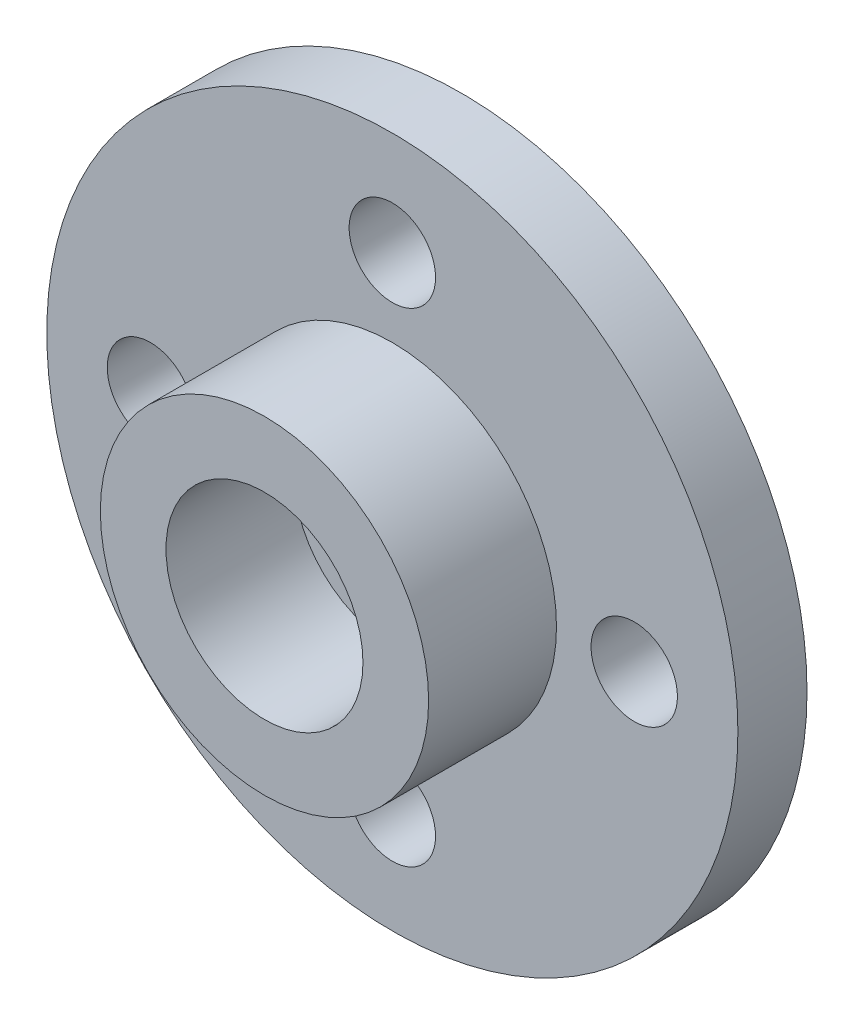
ISO-10303-21;
HEADER;
FILE_DESCRIPTION(('STEP AP214'),'2;1');
FILE_NAME('part.step','',(''),(''),'','','');
FILE_SCHEMA(('AUTOMOTIVE_DESIGN { 1 0 10303 214 1 1 1 1 }'));
ENDSEC;
DATA;
#1=APPLICATION_CONTEXT('core data for automotive mechanical design processes');
#2=APPLICATION_PROTOCOL_DEFINITION('international standard','automotive_design',2000,#1);
#3=PRODUCT_CONTEXT('',#1,'mechanical');
#4=PRODUCT('Part','Part','',(#3));
#5=PRODUCT_RELATED_PRODUCT_CATEGORY('part','',(#4));
#6=PRODUCT_DEFINITION_FORMATION('','',#4);
#7=PRODUCT_DEFINITION_CONTEXT('part definition',#1,'design');
#8=PRODUCT_DEFINITION('design','',#6,#7);
#9=PRODUCT_DEFINITION_SHAPE('','',#8);
#10=(LENGTH_UNIT() NAMED_UNIT(*) SI_UNIT(.MILLI.,.METRE.));
#11=(NAMED_UNIT(*) PLANE_ANGLE_UNIT() SI_UNIT($,.RADIAN.));
#12=(NAMED_UNIT(*) SI_UNIT($,.STERADIAN.) SOLID_ANGLE_UNIT());
#13=UNCERTAINTY_MEASURE_WITH_UNIT(LENGTH_MEASURE(1.E-05),#10,'distance_accuracy_value','');
#14=(GEOMETRIC_REPRESENTATION_CONTEXT(3) GLOBAL_UNCERTAINTY_ASSIGNED_CONTEXT((#13)) GLOBAL_UNIT_ASSIGNED_CONTEXT((#10,
#11,#12)) REPRESENTATION_CONTEXT('',''));
#15=CARTESIAN_POINT('',(0.,0.,0.));
#16=DIRECTION('',(0.,0.,1.));
#17=DIRECTION('',(1.,0.,0.));
#18=AXIS2_PLACEMENT_3D('',#15,#16,#17);
#19=CARTESIAN_POINT('',(0.,0.,2.));
#20=DIRECTION('',(0.,0.,1.));
#21=DIRECTION('',(1.,0.,0.));
#22=AXIS2_PLACEMENT_3D('',#19,#20,#21);
#23=PLANE('',#22);
#24=CARTESIAN_POINT('',(0.,0.,2.));
#25=DIRECTION('',(0.,0.,1.));
#26=DIRECTION('',(1.,0.,0.));
#27=AXIS2_PLACEMENT_3D('',#24,#25,#26);
#28=CIRCLE('',#27,1.65);
#29=CARTESIAN_POINT('',(1.65,0.,2.));
#30=VERTEX_POINT('',#29);
#31=EDGE_CURVE('E46',#30,#30,#28,.T.);
#32=ORIENTED_EDGE('',*,*,#31,.F.);
#33=EDGE_LOOP('',(#32));
#34=FACE_BOUND('',#33,.T.);
#35=CARTESIAN_POINT('',(0.,0.,2.));
#36=DIRECTION('',(0.,0.,1.));
#37=DIRECTION('',(1.,0.,0.));
#38=AXIS2_PLACEMENT_3D('',#35,#36,#37);
#39=CIRCLE('',#38,2.85);
#40=CARTESIAN_POINT('',(2.85,0.,2.));
#41=VERTEX_POINT('',#40);
#42=EDGE_CURVE('E10',#41,#41,#39,.F.);
#43=ORIENTED_EDGE('',*,*,#42,.F.);
#44=EDGE_LOOP('',(#43));
#45=FACE_BOUND('',#44,.T.);
#46=ADVANCED_FACE('F30',(#34,#45),#23,.T.);
#47=CARTESIAN_POINT('',(0.,0.,2.));
#48=DIRECTION('',(0.,0.,1.));
#49=DIRECTION('',(1.,0.,0.));
#50=AXIS2_PLACEMENT_3D('',#47,#48,#49);
#51=CIRCLE('',#50,4.75);
#52=CARTESIAN_POINT('',(4.75,0.,2.));
#53=VERTEX_POINT('',#52);
#54=EDGE_CURVE('E78',#53,#53,#51,.T.);
#55=ORIENTED_EDGE('',*,*,#54,.F.);
#56=EDGE_LOOP('',(#55));
#57=FACE_BOUND('',#56,.T.);
#58=CARTESIAN_POINT('',(3.9618942650685E-13,-7.,2.));
#59=DIRECTION('',(0.,0.,1.));
#60=DIRECTION('',(1.,0.,0.));
#61=AXIS2_PLACEMENT_3D('',#58,#59,#60);
#62=CIRCLE('',#61,1.25000000000043);
#63=CARTESIAN_POINT('',(1.25000000000082,-7.,2.));
#64=VERTEX_POINT('',#63);
#65=EDGE_CURVE('E63',#64,#64,#62,.T.);
#66=ORIENTED_EDGE('',*,*,#65,.F.);
#67=EDGE_LOOP('',(#66));
#68=FACE_BOUND('',#67,.T.);
#69=CARTESIAN_POINT('',(0.,7.,2.));
#70=DIRECTION('',(0.,0.,1.));
#71=DIRECTION('',(1.,0.,0.));
#72=AXIS2_PLACEMENT_3D('',#69,#70,#71);
#73=CIRCLE('',#72,1.25);
#74=CARTESIAN_POINT('',(1.25,7.,2.));
#75=VERTEX_POINT('',#74);
#76=EDGE_CURVE('E51',#75,#75,#73,.T.);
#77=ORIENTED_EDGE('',*,*,#76,.F.);
#78=EDGE_LOOP('',(#77));
#79=FACE_BOUND('',#78,.T.);
#80=CARTESIAN_POINT('',(0.,0.,2.));
#81=DIRECTION('',(0.,0.,1.));
#82=DIRECTION('',(1.,0.,0.));
#83=AXIS2_PLACEMENT_3D('',#80,#81,#82);
#84=CIRCLE('',#83,10.);
#85=CARTESIAN_POINT('',(10.,0.,2.));
#86=VERTEX_POINT('',#85);
#87=EDGE_CURVE('E37',#86,#86,#84,.T.);
#88=ORIENTED_EDGE('',*,*,#87,.T.);
#89=EDGE_LOOP('',(#88));
#90=FACE_BOUND('',#89,.T.);
#91=CARTESIAN_POINT('',(7.0000000000002,1.98094713253425E-13,2.));
#92=DIRECTION('',(0.,0.,1.));
#93=DIRECTION('',(1.,0.,0.));
#94=AXIS2_PLACEMENT_3D('',#91,#92,#93);
#95=CIRCLE('',#94,1.25000000000016);
#96=CARTESIAN_POINT('',(8.25000000000035,1.98094713253425E-13,2.));
#97=VERTEX_POINT('',#96);
#98=EDGE_CURVE('E57',#97,#97,#95,.T.);
#99=ORIENTED_EDGE('',*,*,#98,.F.);
#100=EDGE_LOOP('',(#99));
#101=FACE_BOUND('',#100,.T.);
#102=CARTESIAN_POINT('',(-6.9999999999998,-1.98951966012828E-13,2.));
#103=DIRECTION('',(0.,0.,1.));
#104=DIRECTION('',(1.,0.,0.));
#105=AXIS2_PLACEMENT_3D('',#102,#103,#104);
#106=CIRCLE('',#105,1.25000000000032);
#107=CARTESIAN_POINT('',(-5.74999999999948,-1.98951966012828E-13,2.));
#108=VERTEX_POINT('',#107);
#109=EDGE_CURVE('E69',#108,#108,#106,.T.);
#110=ORIENTED_EDGE('',*,*,#109,.F.);
#111=EDGE_LOOP('',(#110));
#112=FACE_BOUND('',#111,.T.);
#113=ADVANCED_FACE('F106',(#57,#68,#79,#90,#101,#112),#23,.T.);
#114=CARTESIAN_POINT('',(0.,0.,0.));
#115=DIRECTION('',(0.,0.,1.));
#116=DIRECTION('',(1.,0.,0.));
#117=AXIS2_PLACEMENT_3D('',#114,#115,#116);
#118=PLANE('',#117);
#119=CARTESIAN_POINT('',(0.,0.,0.));
#120=DIRECTION('',(0.,0.,1.));
#121=DIRECTION('',(1.,0.,0.));
#122=AXIS2_PLACEMENT_3D('',#119,#120,#121);
#123=CIRCLE('',#122,10.);
#124=CARTESIAN_POINT('',(10.,0.,0.));
#125=VERTEX_POINT('',#124);
#126=EDGE_CURVE('E41',#125,#125,#123,.T.);
#127=ORIENTED_EDGE('',*,*,#126,.F.);
#128=EDGE_LOOP('',(#127));
#129=FACE_BOUND('',#128,.T.);
#130=CARTESIAN_POINT('',(0.,0.,0.));
#131=DIRECTION('',(0.,0.,1.));
#132=DIRECTION('',(1.,0.,0.));
#133=AXIS2_PLACEMENT_3D('',#130,#131,#132);
#134=CIRCLE('',#133,1.65);
#135=CARTESIAN_POINT('',(1.65,0.,0.));
#136=VERTEX_POINT('',#135);
#137=EDGE_CURVE('E48',#136,#136,#134,.T.);
#138=ORIENTED_EDGE('',*,*,#137,.T.);
#139=EDGE_LOOP('',(#138));
#140=FACE_BOUND('',#139,.T.);
#141=CARTESIAN_POINT('',(0.,7.,0.));
#142=DIRECTION('',(0.,0.,1.));
#143=DIRECTION('',(1.,0.,0.));
#144=AXIS2_PLACEMENT_3D('',#141,#142,#143);
#145=CIRCLE('',#144,1.25);
#146=CARTESIAN_POINT('',(1.25,7.,0.));
#147=VERTEX_POINT('',#146);
#148=EDGE_CURVE('E54',#147,#147,#145,.T.);
#149=ORIENTED_EDGE('',*,*,#148,.T.);
#150=EDGE_LOOP('',(#149));
#151=FACE_BOUND('',#150,.T.);
#152=CARTESIAN_POINT('',(7.0000000000002,1.98094713253425E-13,0.));
#153=DIRECTION('',(0.,0.,1.));
#154=DIRECTION('',(1.,0.,0.));
#155=AXIS2_PLACEMENT_3D('',#152,#153,#154);
#156=CIRCLE('',#155,1.25000000000016);
#157=CARTESIAN_POINT('',(8.25000000000035,1.98094713253425E-13,0.));
#158=VERTEX_POINT('',#157);
#159=EDGE_CURVE('E60',#158,#158,#156,.T.);
#160=ORIENTED_EDGE('',*,*,#159,.T.);
#161=EDGE_LOOP('',(#160));
#162=FACE_BOUND('',#161,.T.);
#163=CARTESIAN_POINT('',(3.9618942650685E-13,-7.,0.));
#164=DIRECTION('',(0.,0.,1.));
#165=DIRECTION('',(1.,0.,0.));
#166=AXIS2_PLACEMENT_3D('',#163,#164,#165);
#167=CIRCLE('',#166,1.25000000000043);
#168=CARTESIAN_POINT('',(1.25000000000082,-7.,0.));
#169=VERTEX_POINT('',#168);
#170=EDGE_CURVE('E66',#169,#169,#167,.T.);
#171=ORIENTED_EDGE('',*,*,#170,.T.);
#172=EDGE_LOOP('',(#171));
#173=FACE_BOUND('',#172,.T.);
#174=CARTESIAN_POINT('',(-6.9999999999998,-1.98951966012828E-13,0.));
#175=DIRECTION('',(0.,0.,1.));
#176=DIRECTION('',(1.,0.,0.));
#177=AXIS2_PLACEMENT_3D('',#174,#175,#176);
#178=CIRCLE('',#177,1.25000000000032);
#179=CARTESIAN_POINT('',(-5.74999999999948,-1.98951966012828E-13,0.));
#180=VERTEX_POINT('',#179);
#181=EDGE_CURVE('E72',#180,#180,#178,.T.);
#182=ORIENTED_EDGE('',*,*,#181,.T.);
#183=EDGE_LOOP('',(#182));
#184=FACE_BOUND('',#183,.T.);
#185=ADVANCED_FACE('F112',(#129,#140,#151,#162,#173,#184),#118,.F.);
#186=CARTESIAN_POINT('',(0.,0.,2.));
#187=DIRECTION('',(0.,0.,-1.));
#188=DIRECTION('',(-1.,0.,0.));
#189=AXIS2_PLACEMENT_3D('',#186,#187,#188);
#190=CYLINDRICAL_SURFACE('',#189,10.);
#191=ORIENTED_EDGE('',*,*,#87,.F.);
#192=EDGE_LOOP('',(#191));
#193=FACE_BOUND('',#192,.T.);
#194=ORIENTED_EDGE('',*,*,#126,.T.);
#195=EDGE_LOOP('',(#194));
#196=FACE_BOUND('',#195,.T.);
#197=ADVANCED_FACE('F32',(#193,#196),#190,.T.);
#198=CARTESIAN_POINT('',(0.,0.,2.));
#199=DIRECTION('',(0.,0.,-1.));
#200=DIRECTION('',(-1.,0.,0.));
#201=AXIS2_PLACEMENT_3D('',#198,#199,#200);
#202=CYLINDRICAL_SURFACE('',#201,1.65);
#203=ORIENTED_EDGE('',*,*,#31,.T.);
#204=EDGE_LOOP('',(#203));
#205=FACE_BOUND('',#204,.T.);
#206=ORIENTED_EDGE('',*,*,#137,.F.);
#207=EDGE_LOOP('',(#206));
#208=FACE_BOUND('',#207,.T.);
#209=ADVANCED_FACE('F117',(#205,#208),#202,.F.);
#210=CARTESIAN_POINT('',(0.,7.,2.));
#211=DIRECTION('',(0.,0.,-1.));
#212=DIRECTION('',(-1.,0.,0.));
#213=AXIS2_PLACEMENT_3D('',#210,#211,#212);
#214=CYLINDRICAL_SURFACE('',#213,1.25);
#215=ORIENTED_EDGE('',*,*,#76,.T.);
#216=EDGE_LOOP('',(#215));
#217=FACE_BOUND('',#216,.T.);
#218=ORIENTED_EDGE('',*,*,#148,.F.);
#219=EDGE_LOOP('',(#218));
#220=FACE_BOUND('',#219,.T.);
#221=ADVANCED_FACE('F145',(#217,#220),#214,.F.);
#222=CARTESIAN_POINT('',(7.0000000000002,1.98094713253425E-13,2.));
#223=DIRECTION('',(0.,0.,-1.));
#224=DIRECTION('',(-1.,0.,0.));
#225=AXIS2_PLACEMENT_3D('',#222,#223,#224);
#226=CYLINDRICAL_SURFACE('',#225,1.25000000000016);
#227=ORIENTED_EDGE('',*,*,#98,.T.);
#228=EDGE_LOOP('',(#227));
#229=FACE_BOUND('',#228,.T.);
#230=ORIENTED_EDGE('',*,*,#159,.F.);
#231=EDGE_LOOP('',(#230));
#232=FACE_BOUND('',#231,.T.);
#233=ADVANCED_FACE('F139',(#229,#232),#226,.F.);
#234=CARTESIAN_POINT('',(3.9618942650685E-13,-7.,2.));
#235=DIRECTION('',(0.,0.,-1.));
#236=DIRECTION('',(-1.,0.,0.));
#237=AXIS2_PLACEMENT_3D('',#234,#235,#236);
#238=CYLINDRICAL_SURFACE('',#237,1.25000000000043);
#239=ORIENTED_EDGE('',*,*,#65,.T.);
#240=EDGE_LOOP('',(#239));
#241=FACE_BOUND('',#240,.T.);
#242=ORIENTED_EDGE('',*,*,#170,.F.);
#243=EDGE_LOOP('',(#242));
#244=FACE_BOUND('',#243,.T.);
#245=ADVANCED_FACE('F101',(#241,#244),#238,.F.);
#246=CARTESIAN_POINT('',(-6.9999999999998,-1.98951966012828E-13,2.));
#247=DIRECTION('',(0.,0.,-1.));
#248=DIRECTION('',(-1.,0.,0.));
#249=AXIS2_PLACEMENT_3D('',#246,#247,#248);
#250=CYLINDRICAL_SURFACE('',#249,1.25000000000032);
#251=ORIENTED_EDGE('',*,*,#109,.T.);
#252=EDGE_LOOP('',(#251));
#253=FACE_BOUND('',#252,.T.);
#254=ORIENTED_EDGE('',*,*,#181,.F.);
#255=EDGE_LOOP('',(#254));
#256=FACE_BOUND('',#255,.T.);
#257=ADVANCED_FACE('F92',(#253,#256),#250,.F.);
#258=CARTESIAN_POINT('',(0.,0.,5.7));
#259=DIRECTION('',(0.,0.,1.));
#260=DIRECTION('',(1.,0.,0.));
#261=AXIS2_PLACEMENT_3D('',#258,#259,#260);
#262=PLANE('',#261);
#263=CARTESIAN_POINT('',(0.,0.,5.7));
#264=DIRECTION('',(0.,0.,1.));
#265=DIRECTION('',(1.,0.,0.));
#266=AXIS2_PLACEMENT_3D('',#263,#264,#265);
#267=CIRCLE('',#266,4.75);
#268=CARTESIAN_POINT('',(4.75,0.,5.7));
#269=VERTEX_POINT('',#268);
#270=EDGE_CURVE('E75',#269,#269,#267,.T.);
#271=ORIENTED_EDGE('',*,*,#270,.T.);
#272=EDGE_LOOP('',(#271));
#273=FACE_BOUND('',#272,.T.);
#274=CARTESIAN_POINT('',(0.,0.,5.7));
#275=DIRECTION('',(0.,0.,1.));
#276=DIRECTION('',(1.,0.,0.));
#277=AXIS2_PLACEMENT_3D('',#274,#275,#276);
#278=CIRCLE('',#277,2.85);
#279=CARTESIAN_POINT('',(2.85,0.,5.7));
#280=VERTEX_POINT('',#279);
#281=EDGE_CURVE('E81',#280,#280,#278,.T.);
#282=ORIENTED_EDGE('',*,*,#281,.F.);
#283=EDGE_LOOP('',(#282));
#284=FACE_BOUND('',#283,.T.);
#285=ADVANCED_FACE('F89',(#273,#284),#262,.T.);
#286=CARTESIAN_POINT('',(0.,0.,5.7));
#287=DIRECTION('',(0.,0.,-1.));
#288=DIRECTION('',(-1.,0.,0.));
#289=AXIS2_PLACEMENT_3D('',#286,#287,#288);
#290=CYLINDRICAL_SURFACE('',#289,4.75);
#291=ORIENTED_EDGE('',*,*,#270,.F.);
#292=EDGE_LOOP('',(#291));
#293=FACE_BOUND('',#292,.T.);
#294=ORIENTED_EDGE('',*,*,#54,.T.);
#295=EDGE_LOOP('',(#294));
#296=FACE_BOUND('',#295,.T.);
#297=ADVANCED_FACE('F91',(#293,#296),#290,.T.);
#298=CARTESIAN_POINT('',(0.,0.,5.7));
#299=DIRECTION('',(0.,0.,-1.));
#300=DIRECTION('',(-1.,0.,0.));
#301=AXIS2_PLACEMENT_3D('',#298,#299,#300);
#302=CYLINDRICAL_SURFACE('',#301,2.85);
#303=ORIENTED_EDGE('',*,*,#281,.T.);
#304=EDGE_LOOP('',(#303));
#305=FACE_BOUND('',#304,.T.);
#306=ORIENTED_EDGE('',*,*,#42,.T.);
#307=EDGE_LOOP('',(#306));
#308=FACE_BOUND('',#307,.T.);
#309=ADVANCED_FACE('F87',(#305,#308),#302,.F.);
#310=CLOSED_SHELL('',(#46,#113,#185,#197,#209,#221,#233,#245,#257,#285,#297,#309));
#311=MANIFOLD_SOLID_BREP('B2',#310);
#312=ADVANCED_BREP_SHAPE_REPRESENTATION('',(#18,#311),#14);
#313=SHAPE_DEFINITION_REPRESENTATION(#9,#312);
ENDSEC;
END-ISO-10303-21;
